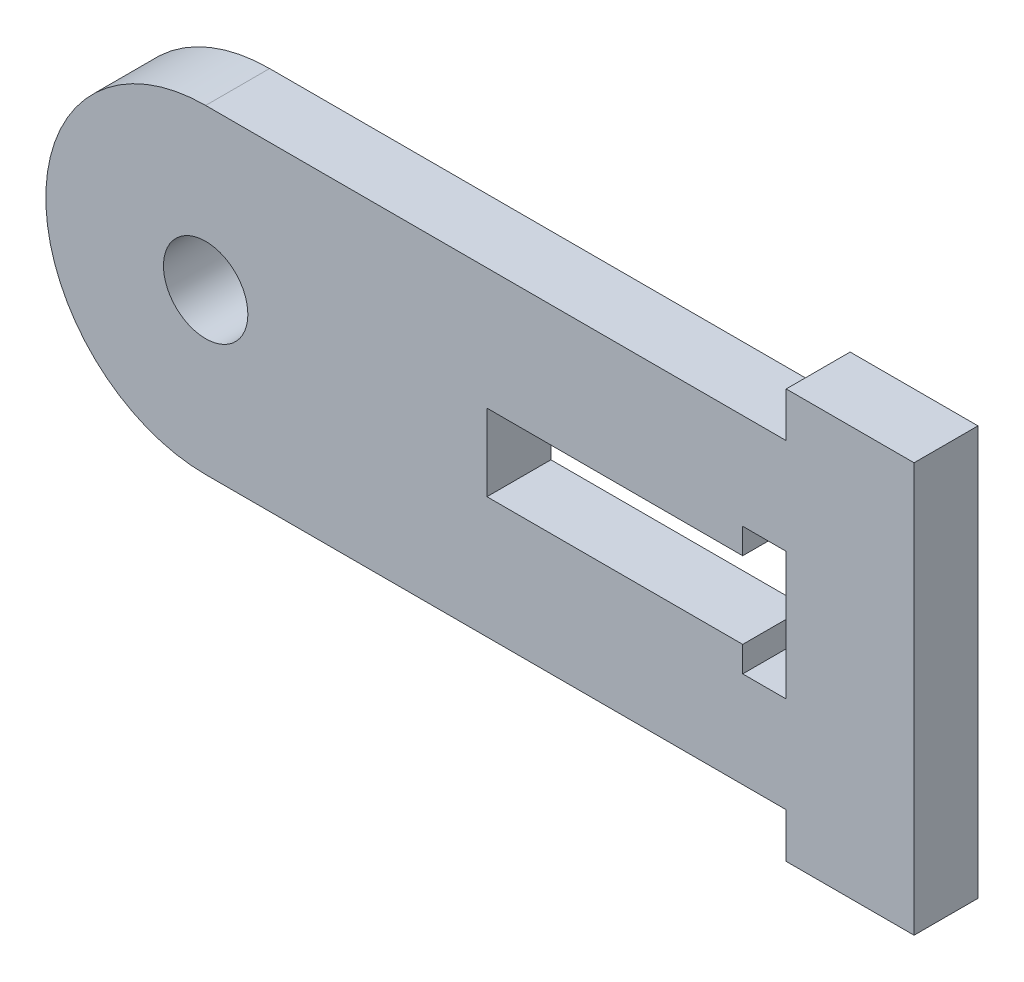
ISO-10303-21;
HEADER;
FILE_DESCRIPTION(('STEP AP214'),'2;1');
FILE_NAME('part.step','',(''),(''),'','','');
FILE_SCHEMA(('AUTOMOTIVE_DESIGN { 1 0 10303 214 1 1 1 1 }'));
ENDSEC;
DATA;
#1=APPLICATION_CONTEXT('core data for automotive mechanical design processes');
#2=APPLICATION_PROTOCOL_DEFINITION('international standard','automotive_design',2000,#1);
#3=PRODUCT_CONTEXT('',#1,'mechanical');
#4=PRODUCT('Part','Part','',(#3));
#5=PRODUCT_RELATED_PRODUCT_CATEGORY('part','',(#4));
#6=PRODUCT_DEFINITION_FORMATION('','',#4);
#7=PRODUCT_DEFINITION_CONTEXT('part definition',#1,'design');
#8=PRODUCT_DEFINITION('design','',#6,#7);
#9=PRODUCT_DEFINITION_SHAPE('','',#8);
#10=(LENGTH_UNIT() NAMED_UNIT(*) SI_UNIT(.MILLI.,.METRE.));
#11=(NAMED_UNIT(*) PLANE_ANGLE_UNIT() SI_UNIT($,.RADIAN.));
#12=(NAMED_UNIT(*) SI_UNIT($,.STERADIAN.) SOLID_ANGLE_UNIT());
#13=UNCERTAINTY_MEASURE_WITH_UNIT(LENGTH_MEASURE(1.E-05),#10,'distance_accuracy_value','');
#14=(GEOMETRIC_REPRESENTATION_CONTEXT(3) GLOBAL_UNCERTAINTY_ASSIGNED_CONTEXT((#13)) GLOBAL_UNIT_ASSIGNED_CONTEXT((#10,
#11,#12)) REPRESENTATION_CONTEXT('',''));
#15=CARTESIAN_POINT('',(0.,0.,0.));
#16=DIRECTION('',(0.,0.,1.));
#17=DIRECTION('',(1.,0.,0.));
#18=AXIS2_PLACEMENT_3D('',#15,#16,#17);
#19=CARTESIAN_POINT('',(21.,2.5,-5.00000000001367E-05));
#20=DIRECTION('',(-1.,0.,0.));
#21=DIRECTION('',(0.,0.,1.));
#22=AXIS2_PLACEMENT_3D('',#19,#20,#21);
#23=PLANE('',#22);
#24=DIRECTION('',(0.,-1.,0.));
#25=VECTOR('',#24,1.);
#26=CARTESIAN_POINT('',(21.,0.,0.));
#27=LINE('',#26,#25);
#28=CARTESIAN_POINT('',(21.,-1.5,0.));
#29=VERTEX_POINT('',#28);
#30=CARTESIAN_POINT('',(21.,-2.5,0.));
#31=VERTEX_POINT('',#30);
#32=EDGE_CURVE('E330',#29,#31,#27,.T.);
#33=ORIENTED_EDGE('',*,*,#32,.F.);
#34=DIRECTION('',(0.,0.,1.));
#35=VECTOR('',#34,1.);
#36=CARTESIAN_POINT('',(21.,-1.5,-5.00000000001367E-05));
#37=LINE('',#36,#35);
#38=CARTESIAN_POINT('',(21.,-1.5,2.5));
#39=VERTEX_POINT('',#38);
#40=EDGE_CURVE('E43',#29,#39,#37,.T.);
#41=ORIENTED_EDGE('',*,*,#40,.T.);
#42=DIRECTION('',(0.,-1.,0.));
#43=VECTOR('',#42,1.);
#44=CARTESIAN_POINT('',(21.,2.5,2.5));
#45=LINE('',#44,#43);
#46=CARTESIAN_POINT('',(21.,-2.5,2.5));
#47=VERTEX_POINT('',#46);
#48=EDGE_CURVE('E173',#39,#47,#45,.T.);
#49=ORIENTED_EDGE('',*,*,#48,.T.);
#50=DIRECTION('',(0.,0.,1.));
#51=VECTOR('',#50,1.);
#52=CARTESIAN_POINT('',(21.,-2.5,-5.00000000001367E-05));
#53=LINE('',#52,#51);
#54=EDGE_CURVE('E185',#31,#47,#53,.T.);
#55=ORIENTED_EDGE('',*,*,#54,.F.);
#56=EDGE_LOOP('',(#33,#41,#49,#55));
#57=FACE_BOUND('',#56,.T.);
#58=ADVANCED_FACE('F35',(#57),#23,.F.);
#59=CARTESIAN_POINT('',(0.,6.25,2.5));
#60=DIRECTION('',(0.,1.,0.));
#61=DIRECTION('',(0.,0.,1.));
#62=AXIS2_PLACEMENT_3D('',#59,#60,#61);
#63=PLANE('',#62);
#64=DIRECTION('',(1.,0.,0.));
#65=VECTOR('',#64,1.);
#66=CARTESIAN_POINT('',(0.,6.25,0.));
#67=LINE('',#66,#65);
#68=CARTESIAN_POINT('',(0.,6.25,0.));
#69=VERTEX_POINT('',#68);
#70=CARTESIAN_POINT('',(22.7,6.25,0.));
#71=VERTEX_POINT('',#70);
#72=EDGE_CURVE('E251',#69,#71,#67,.T.);
#73=ORIENTED_EDGE('',*,*,#72,.F.);
#74=DIRECTION('',(0.,0.,-1.));
#75=VECTOR('',#74,1.);
#76=CARTESIAN_POINT('',(0.,6.25,2.5));
#77=LINE('',#76,#75);
#78=CARTESIAN_POINT('',(0.,6.25,2.5));
#79=VERTEX_POINT('',#78);
#80=EDGE_CURVE('E340',#79,#69,#77,.T.);
#81=ORIENTED_EDGE('',*,*,#80,.F.);
#82=DIRECTION('',(1.,0.,0.));
#83=VECTOR('',#82,1.);
#84=CARTESIAN_POINT('',(0.,6.25,2.5));
#85=LINE('',#84,#83);
#86=CARTESIAN_POINT('',(22.7,6.25,2.5));
#87=VERTEX_POINT('',#86);
#88=EDGE_CURVE('E347',#79,#87,#85,.T.);
#89=ORIENTED_EDGE('',*,*,#88,.T.);
#90=DIRECTION('',(0.,0.,-1.));
#91=VECTOR('',#90,1.);
#92=CARTESIAN_POINT('',(22.7,6.25,2.5));
#93=LINE('',#92,#91);
#94=EDGE_CURVE('E256',#87,#71,#93,.T.);
#95=ORIENTED_EDGE('',*,*,#94,.T.);
#96=EDGE_LOOP('',(#73,#81,#89,#95));
#97=FACE_BOUND('',#96,.T.);
#98=ADVANCED_FACE('F274',(#97),#63,.T.);
#99=CARTESIAN_POINT('',(0.,0.,2.5));
#100=DIRECTION('',(0.,0.,-1.));
#101=DIRECTION('',(-1.,0.,0.));
#102=AXIS2_PLACEMENT_3D('',#99,#100,#101);
#103=CYLINDRICAL_SURFACE('',#102,6.25);
#104=CARTESIAN_POINT('',(0.,0.,0.));
#105=DIRECTION('',(0.,0.,1.));
#106=DIRECTION('',(1.,0.,0.));
#107=AXIS2_PLACEMENT_3D('',#104,#105,#106);
#108=CIRCLE('',#107,6.25);
#109=CARTESIAN_POINT('',(0.,-6.25,0.));
#110=VERTEX_POINT('',#109);
#111=EDGE_CURVE('E344',#69,#110,#108,.T.);
#112=ORIENTED_EDGE('',*,*,#111,.T.);
#113=DIRECTION('',(0.,0.,-1.));
#114=VECTOR('',#113,1.);
#115=CARTESIAN_POINT('',(0.,-6.25,2.5));
#116=LINE('',#115,#114);
#117=CARTESIAN_POINT('',(0.,-6.25,2.5));
#118=VERTEX_POINT('',#117);
#119=EDGE_CURVE('E363',#118,#110,#116,.T.);
#120=ORIENTED_EDGE('',*,*,#119,.F.);
#121=CARTESIAN_POINT('',(0.,0.,2.5));
#122=DIRECTION('',(0.,0.,1.));
#123=DIRECTION('',(1.,0.,0.));
#124=AXIS2_PLACEMENT_3D('',#121,#122,#123);
#125=CIRCLE('',#124,6.25);
#126=EDGE_CURVE('E349',#79,#118,#125,.T.);
#127=ORIENTED_EDGE('',*,*,#126,.F.);
#128=ORIENTED_EDGE('',*,*,#80,.T.);
#129=EDGE_LOOP('',(#112,#120,#127,#128));
#130=FACE_BOUND('',#129,.T.);
#131=ADVANCED_FACE('F280',(#130),#103,.T.);
#132=CARTESIAN_POINT('',(0.,-6.25,2.5));
#133=DIRECTION('',(0.,1.,0.));
#134=DIRECTION('',(0.,0.,1.));
#135=AXIS2_PLACEMENT_3D('',#132,#133,#134);
#136=PLANE('',#135);
#137=DIRECTION('',(1.,0.,0.));
#138=VECTOR('',#137,1.);
#139=CARTESIAN_POINT('',(0.,-6.25,0.));
#140=LINE('',#139,#138);
#141=CARTESIAN_POINT('',(22.7,-6.25,0.));
#142=VERTEX_POINT('',#141);
#143=EDGE_CURVE('E391',#110,#142,#140,.T.);
#144=ORIENTED_EDGE('',*,*,#143,.T.);
#145=DIRECTION('',(0.,0.,-1.));
#146=VECTOR('',#145,1.);
#147=CARTESIAN_POINT('',(22.7,-6.25,2.5));
#148=LINE('',#147,#146);
#149=CARTESIAN_POINT('',(22.7,-6.25,2.5));
#150=VERTEX_POINT('',#149);
#151=EDGE_CURVE('E353',#150,#142,#148,.T.);
#152=ORIENTED_EDGE('',*,*,#151,.F.);
#153=DIRECTION('',(1.,0.,0.));
#154=VECTOR('',#153,1.);
#155=CARTESIAN_POINT('',(0.,-6.25,2.5));
#156=LINE('',#155,#154);
#157=EDGE_CURVE('E354',#118,#150,#156,.T.);
#158=ORIENTED_EDGE('',*,*,#157,.F.);
#159=ORIENTED_EDGE('',*,*,#119,.T.);
#160=EDGE_LOOP('',(#144,#152,#158,#159));
#161=FACE_BOUND('',#160,.T.);
#162=ADVANCED_FACE('F380',(#161),#136,.F.);
#163=CARTESIAN_POINT('',(0.,0.,2.5));
#164=DIRECTION('',(0.,0.,-1.));
#165=DIRECTION('',(-1.,0.,0.));
#166=AXIS2_PLACEMENT_3D('',#163,#164,#165);
#167=CYLINDRICAL_SURFACE('',#166,1.65);
#168=CARTESIAN_POINT('',(0.,0.,2.5));
#169=DIRECTION('',(0.,0.,1.));
#170=DIRECTION('',(1.,0.,0.));
#171=AXIS2_PLACEMENT_3D('',#168,#169,#170);
#172=CIRCLE('',#171,1.65);
#173=CARTESIAN_POINT('',(1.65,0.,2.5));
#174=VERTEX_POINT('',#173);
#175=EDGE_CURVE('E350',#174,#174,#172,.T.);
#176=ORIENTED_EDGE('',*,*,#175,.T.);
#177=EDGE_LOOP('',(#176));
#178=FACE_BOUND('',#177,.T.);
#179=CARTESIAN_POINT('',(0.,0.,0.));
#180=DIRECTION('',(0.,0.,1.));
#181=DIRECTION('',(1.,0.,0.));
#182=AXIS2_PLACEMENT_3D('',#179,#180,#181);
#183=CIRCLE('',#182,1.65);
#184=CARTESIAN_POINT('',(1.65,0.,0.));
#185=VERTEX_POINT('',#184);
#186=EDGE_CURVE('E222',#185,#185,#183,.T.);
#187=ORIENTED_EDGE('',*,*,#186,.F.);
#188=EDGE_LOOP('',(#187));
#189=FACE_BOUND('',#188,.T.);
#190=ADVANCED_FACE('F37',(#178,#189),#167,.F.);
#191=CARTESIAN_POINT('',(0.,0.,2.5));
#192=DIRECTION('',(0.,0.,1.));
#193=DIRECTION('',(1.,0.,0.));
#194=AXIS2_PLACEMENT_3D('',#191,#192,#193);
#195=PLANE('',#194);
#196=DIRECTION('',(1.,0.,0.));
#197=VECTOR('',#196,1.);
#198=CARTESIAN_POINT('',(21.,-1.5,2.5));
#199=LINE('',#198,#197);
#200=CARTESIAN_POINT('',(11.,-1.5,2.5));
#201=VERTEX_POINT('',#200);
#202=EDGE_CURVE('E312',#201,#39,#199,.T.);
#203=ORIENTED_EDGE('',*,*,#202,.F.);
#204=DIRECTION('',(0.,-1.,0.));
#205=VECTOR('',#204,1.);
#206=CARTESIAN_POINT('',(11.,-1.5,2.5));
#207=LINE('',#206,#205);
#208=CARTESIAN_POINT('',(11.,1.5,2.5));
#209=VERTEX_POINT('',#208);
#210=EDGE_CURVE('E167',#209,#201,#207,.T.);
#211=ORIENTED_EDGE('',*,*,#210,.F.);
#212=DIRECTION('',(-1.,0.,0.));
#213=VECTOR('',#212,1.);
#214=CARTESIAN_POINT('',(21.,1.5,2.5));
#215=LINE('',#214,#213);
#216=CARTESIAN_POINT('',(21.,1.5,2.5));
#217=VERTEX_POINT('',#216);
#218=EDGE_CURVE('E151',#217,#209,#215,.T.);
#219=ORIENTED_EDGE('',*,*,#218,.F.);
#220=CARTESIAN_POINT('',(21.,2.5,2.5));
#221=VERTEX_POINT('',#220);
#222=EDGE_CURVE('E165',#221,#217,#45,.T.);
#223=ORIENTED_EDGE('',*,*,#222,.F.);
#224=DIRECTION('',(-1.,0.,0.));
#225=VECTOR('',#224,1.);
#226=CARTESIAN_POINT('',(22.7,2.5,2.5));
#227=LINE('',#226,#225);
#228=CARTESIAN_POINT('',(22.7,2.5,2.5));
#229=VERTEX_POINT('',#228);
#230=EDGE_CURVE('E178',#229,#221,#227,.T.);
#231=ORIENTED_EDGE('',*,*,#230,.F.);
#232=DIRECTION('',(0.,1.,0.));
#233=VECTOR('',#232,1.);
#234=CARTESIAN_POINT('',(22.7,2.5,2.5));
#235=LINE('',#234,#233);
#236=CARTESIAN_POINT('',(22.7,-2.5,2.5));
#237=VERTEX_POINT('',#236);
#238=EDGE_CURVE('E58',#237,#229,#235,.T.);
#239=ORIENTED_EDGE('',*,*,#238,.F.);
#240=DIRECTION('',(1.,0.,0.));
#241=VECTOR('',#240,1.);
#242=CARTESIAN_POINT('',(22.7,-2.5,2.5));
#243=LINE('',#242,#241);
#244=EDGE_CURVE('E172',#47,#237,#243,.T.);
#245=ORIENTED_EDGE('',*,*,#244,.F.);
#246=ORIENTED_EDGE('',*,*,#48,.F.);
#247=EDGE_LOOP('',(#203,#211,#219,#223,#231,#239,#245,#246));
#248=FACE_BOUND('',#247,.T.);
#249=ORIENTED_EDGE('',*,*,#175,.F.);
#250=EDGE_LOOP('',(#249));
#251=FACE_BOUND('',#250,.T.);
#252=ORIENTED_EDGE('',*,*,#88,.F.);
#253=ORIENTED_EDGE('',*,*,#126,.T.);
#254=ORIENTED_EDGE('',*,*,#157,.T.);
#255=DIRECTION('',(0.,-1.,0.));
#256=VECTOR('',#255,1.);
#257=CARTESIAN_POINT('',(22.7,-8.,2.5));
#258=LINE('',#257,#256);
#259=CARTESIAN_POINT('',(22.7,-8.,2.5));
#260=VERTEX_POINT('',#259);
#261=EDGE_CURVE('E184',#150,#260,#258,.T.);
#262=ORIENTED_EDGE('',*,*,#261,.T.);
#263=DIRECTION('',(1.,0.,0.));
#264=VECTOR('',#263,1.);
#265=CARTESIAN_POINT('',(22.7,-8.,2.5));
#266=LINE('',#265,#264);
#267=CARTESIAN_POINT('',(27.7,-8.,2.5));
#268=VERTEX_POINT('',#267);
#269=EDGE_CURVE('E210',#260,#268,#266,.T.);
#270=ORIENTED_EDGE('',*,*,#269,.T.);
#271=DIRECTION('',(0.,1.,0.));
#272=VECTOR('',#271,1.);
#273=CARTESIAN_POINT('',(27.7,-8.,2.5));
#274=LINE('',#273,#272);
#275=CARTESIAN_POINT('',(27.7,8.,2.5));
#276=VERTEX_POINT('',#275);
#277=EDGE_CURVE('E214',#268,#276,#274,.T.);
#278=ORIENTED_EDGE('',*,*,#277,.T.);
#279=DIRECTION('',(-1.,0.,0.));
#280=VECTOR('',#279,1.);
#281=CARTESIAN_POINT('',(22.7,8.,2.5));
#282=LINE('',#281,#280);
#283=CARTESIAN_POINT('',(22.7,8.,2.5));
#284=VERTEX_POINT('',#283);
#285=EDGE_CURVE('E217',#276,#284,#282,.T.);
#286=ORIENTED_EDGE('',*,*,#285,.T.);
#287=EDGE_CURVE('E204',#284,#87,#258,.T.);
#288=ORIENTED_EDGE('',*,*,#287,.T.);
#289=EDGE_LOOP('',(#252,#253,#254,#262,#270,#278,#286,#288));
#290=FACE_BOUND('',#289,.T.);
#291=ADVANCED_FACE('F162',(#248,#251,#290),#195,.T.);
#292=CARTESIAN_POINT('',(0.,0.,0.));
#293=DIRECTION('',(0.,0.,1.));
#294=DIRECTION('',(1.,0.,0.));
#295=AXIS2_PLACEMENT_3D('',#292,#293,#294);
#296=PLANE('',#295);
#297=DIRECTION('',(0.,-1.,0.));
#298=VECTOR('',#297,1.);
#299=CARTESIAN_POINT('',(11.,0.,0.));
#300=LINE('',#299,#298);
#301=CARTESIAN_POINT('',(11.,1.5,0.));
#302=VERTEX_POINT('',#301);
#303=CARTESIAN_POINT('',(11.,-1.5,0.));
#304=VERTEX_POINT('',#303);
#305=EDGE_CURVE('E11',#302,#304,#300,.T.);
#306=ORIENTED_EDGE('',*,*,#305,.T.);
#307=DIRECTION('',(1.,0.,0.));
#308=VECTOR('',#307,1.);
#309=CARTESIAN_POINT('',(0.,-1.5,0.));
#310=LINE('',#309,#308);
#311=EDGE_CURVE('E315',#304,#29,#310,.T.);
#312=ORIENTED_EDGE('',*,*,#311,.T.);
#313=ORIENTED_EDGE('',*,*,#32,.T.);
#314=DIRECTION('',(1.,0.,0.));
#315=VECTOR('',#314,1.);
#316=CARTESIAN_POINT('',(0.,-2.5,0.));
#317=LINE('',#316,#315);
#318=CARTESIAN_POINT('',(22.7,-2.5,0.));
#319=VERTEX_POINT('',#318);
#320=EDGE_CURVE('E329',#31,#319,#317,.T.);
#321=ORIENTED_EDGE('',*,*,#320,.T.);
#322=DIRECTION('',(0.,1.,0.));
#323=VECTOR('',#322,1.);
#324=CARTESIAN_POINT('',(22.7,0.,0.));
#325=LINE('',#324,#323);
#326=CARTESIAN_POINT('',(22.7,2.5,0.));
#327=VERTEX_POINT('',#326);
#328=EDGE_CURVE('E157',#319,#327,#325,.T.);
#329=ORIENTED_EDGE('',*,*,#328,.T.);
#330=DIRECTION('',(-1.,0.,0.));
#331=VECTOR('',#330,1.);
#332=CARTESIAN_POINT('',(0.,2.5,0.));
#333=LINE('',#332,#331);
#334=CARTESIAN_POINT('',(21.,2.5,0.));
#335=VERTEX_POINT('',#334);
#336=EDGE_CURVE('E337',#327,#335,#333,.T.);
#337=ORIENTED_EDGE('',*,*,#336,.T.);
#338=CARTESIAN_POINT('',(21.,1.5,0.));
#339=VERTEX_POINT('',#338);
#340=EDGE_CURVE('E335',#335,#339,#27,.T.);
#341=ORIENTED_EDGE('',*,*,#340,.T.);
#342=DIRECTION('',(-1.,0.,0.));
#343=VECTOR('',#342,1.);
#344=CARTESIAN_POINT('',(0.,1.5,0.));
#345=LINE('',#344,#343);
#346=EDGE_CURVE('E50',#339,#302,#345,.T.);
#347=ORIENTED_EDGE('',*,*,#346,.T.);
#348=EDGE_LOOP('',(#306,#312,#313,#321,#329,#337,#341,#347));
#349=FACE_BOUND('',#348,.T.);
#350=ORIENTED_EDGE('',*,*,#186,.T.);
#351=EDGE_LOOP('',(#350));
#352=FACE_BOUND('',#351,.T.);
#353=ORIENTED_EDGE('',*,*,#72,.T.);
#354=DIRECTION('',(0.,-1.,0.));
#355=VECTOR('',#354,1.);
#356=CARTESIAN_POINT('',(22.7,-8.,0.));
#357=LINE('',#356,#355);
#358=CARTESIAN_POINT('',(22.7,8.,0.));
#359=VERTEX_POINT('',#358);
#360=EDGE_CURVE('E199',#359,#71,#357,.T.);
#361=ORIENTED_EDGE('',*,*,#360,.F.);
#362=DIRECTION('',(-1.,0.,0.));
#363=VECTOR('',#362,1.);
#364=CARTESIAN_POINT('',(22.7,8.,0.));
#365=LINE('',#364,#363);
#366=CARTESIAN_POINT('',(27.7,8.,0.));
#367=VERTEX_POINT('',#366);
#368=EDGE_CURVE('E209',#367,#359,#365,.T.);
#369=ORIENTED_EDGE('',*,*,#368,.F.);
#370=DIRECTION('',(0.,1.,0.));
#371=VECTOR('',#370,1.);
#372=CARTESIAN_POINT('',(27.7,-8.,0.));
#373=LINE('',#372,#371);
#374=CARTESIAN_POINT('',(27.7,-8.,0.));
#375=VERTEX_POINT('',#374);
#376=EDGE_CURVE('E233',#375,#367,#373,.T.);
#377=ORIENTED_EDGE('',*,*,#376,.F.);
#378=DIRECTION('',(1.,0.,0.));
#379=VECTOR('',#378,1.);
#380=CARTESIAN_POINT('',(22.7,-8.,0.));
#381=LINE('',#380,#379);
#382=CARTESIAN_POINT('',(22.7,-8.,0.));
#383=VERTEX_POINT('',#382);
#384=EDGE_CURVE('E192',#383,#375,#381,.T.);
#385=ORIENTED_EDGE('',*,*,#384,.F.);
#386=EDGE_CURVE('E196',#142,#383,#357,.T.);
#387=ORIENTED_EDGE('',*,*,#386,.F.);
#388=ORIENTED_EDGE('',*,*,#143,.F.);
#389=ORIENTED_EDGE('',*,*,#111,.F.);
#390=EDGE_LOOP('',(#353,#361,#369,#377,#385,#387,#388,#389));
#391=FACE_BOUND('',#390,.T.);
#392=ADVANCED_FACE('F247',(#349,#352,#391),#296,.F.);
#393=CARTESIAN_POINT('',(22.7,-8.,0.));
#394=DIRECTION('',(-1.,0.,0.));
#395=DIRECTION('',(0.,0.,1.));
#396=AXIS2_PLACEMENT_3D('',#393,#394,#395);
#397=PLANE('',#396);
#398=ORIENTED_EDGE('',*,*,#94,.F.);
#399=ORIENTED_EDGE('',*,*,#287,.F.);
#400=DIRECTION('',(0.,0.,1.));
#401=VECTOR('',#400,1.);
#402=CARTESIAN_POINT('',(22.7,8.,0.));
#403=LINE('',#402,#401);
#404=EDGE_CURVE('E220',#359,#284,#403,.T.);
#405=ORIENTED_EDGE('',*,*,#404,.F.);
#406=ORIENTED_EDGE('',*,*,#360,.T.);
#407=EDGE_LOOP('',(#398,#399,#405,#406));
#408=FACE_BOUND('',#407,.T.);
#409=ADVANCED_FACE('F254',(#408),#397,.T.);
#410=ORIENTED_EDGE('',*,*,#261,.F.);
#411=ORIENTED_EDGE('',*,*,#151,.T.);
#412=ORIENTED_EDGE('',*,*,#386,.T.);
#413=DIRECTION('',(0.,0.,1.));
#414=VECTOR('',#413,1.);
#415=CARTESIAN_POINT('',(22.7,-8.,0.));
#416=LINE('',#415,#414);
#417=EDGE_CURVE('E226',#383,#260,#416,.T.);
#418=ORIENTED_EDGE('',*,*,#417,.T.);
#419=EDGE_LOOP('',(#410,#411,#412,#418));
#420=FACE_BOUND('',#419,.T.);
#421=ADVANCED_FACE('F271',(#420),#397,.T.);
#422=CARTESIAN_POINT('',(22.7,8.,0.));
#423=DIRECTION('',(0.,1.,0.));
#424=DIRECTION('',(0.,0.,1.));
#425=AXIS2_PLACEMENT_3D('',#422,#423,#424);
#426=PLANE('',#425);
#427=ORIENTED_EDGE('',*,*,#285,.F.);
#428=DIRECTION('',(0.,0.,1.));
#429=VECTOR('',#428,1.);
#430=CARTESIAN_POINT('',(27.7,8.,0.));
#431=LINE('',#430,#429);
#432=EDGE_CURVE('E223',#367,#276,#431,.T.);
#433=ORIENTED_EDGE('',*,*,#432,.F.);
#434=ORIENTED_EDGE('',*,*,#368,.T.);
#435=ORIENTED_EDGE('',*,*,#404,.T.);
#436=EDGE_LOOP('',(#427,#433,#434,#435));
#437=FACE_BOUND('',#436,.T.);
#438=ADVANCED_FACE('F259',(#437),#426,.T.);
#439=CARTESIAN_POINT('',(27.7,-8.,0.));
#440=DIRECTION('',(1.,0.,0.));
#441=DIRECTION('',(0.,0.,-1.));
#442=AXIS2_PLACEMENT_3D('',#439,#440,#441);
#443=PLANE('',#442);
#444=ORIENTED_EDGE('',*,*,#277,.F.);
#445=DIRECTION('',(0.,0.,1.));
#446=VECTOR('',#445,1.);
#447=CARTESIAN_POINT('',(27.7,-8.,0.));
#448=LINE('',#447,#446);
#449=EDGE_CURVE('E225',#375,#268,#448,.T.);
#450=ORIENTED_EDGE('',*,*,#449,.F.);
#451=ORIENTED_EDGE('',*,*,#376,.T.);
#452=ORIENTED_EDGE('',*,*,#432,.T.);
#453=EDGE_LOOP('',(#444,#450,#451,#452));
#454=FACE_BOUND('',#453,.T.);
#455=ADVANCED_FACE('F262',(#454),#443,.T.);
#456=CARTESIAN_POINT('',(22.7,-8.,0.));
#457=DIRECTION('',(0.,-1.,0.));
#458=DIRECTION('',(0.,0.,-1.));
#459=AXIS2_PLACEMENT_3D('',#456,#457,#458);
#460=PLANE('',#459);
#461=ORIENTED_EDGE('',*,*,#269,.F.);
#462=ORIENTED_EDGE('',*,*,#417,.F.);
#463=ORIENTED_EDGE('',*,*,#384,.T.);
#464=ORIENTED_EDGE('',*,*,#449,.T.);
#465=EDGE_LOOP('',(#461,#462,#463,#464));
#466=FACE_BOUND('',#465,.T.);
#467=ADVANCED_FACE('F242',(#466),#460,.T.);
#468=CARTESIAN_POINT('',(22.7,2.5,-5.00000000001367E-05));
#469=DIRECTION('',(1.,0.,0.));
#470=DIRECTION('',(0.,0.,-1.));
#471=AXIS2_PLACEMENT_3D('',#468,#469,#470);
#472=PLANE('',#471);
#473=DIRECTION('',(0.,0.,1.));
#474=VECTOR('',#473,1.);
#475=CARTESIAN_POINT('',(22.7,-2.5,-5.00000000001367E-05));
#476=LINE('',#475,#474);
#477=EDGE_CURVE('E182',#319,#237,#476,.T.);
#478=ORIENTED_EDGE('',*,*,#477,.T.);
#479=ORIENTED_EDGE('',*,*,#238,.T.);
#480=DIRECTION('',(0.,0.,1.));
#481=VECTOR('',#480,1.);
#482=CARTESIAN_POINT('',(22.7,2.5,-5.00000000001367E-05));
#483=LINE('',#482,#481);
#484=EDGE_CURVE('E176',#327,#229,#483,.T.);
#485=ORIENTED_EDGE('',*,*,#484,.F.);
#486=ORIENTED_EDGE('',*,*,#328,.F.);
#487=EDGE_LOOP('',(#478,#479,#485,#486));
#488=FACE_BOUND('',#487,.T.);
#489=ADVANCED_FACE('F269',(#488),#472,.F.);
#490=CARTESIAN_POINT('',(22.7,-2.5,-5.00000000001367E-05));
#491=DIRECTION('',(0.,-1.,0.));
#492=DIRECTION('',(0.,0.,-1.));
#493=AXIS2_PLACEMENT_3D('',#490,#491,#492);
#494=PLANE('',#493);
#495=ORIENTED_EDGE('',*,*,#54,.T.);
#496=ORIENTED_EDGE('',*,*,#244,.T.);
#497=ORIENTED_EDGE('',*,*,#477,.F.);
#498=ORIENTED_EDGE('',*,*,#320,.F.);
#499=EDGE_LOOP('',(#495,#496,#497,#498));
#500=FACE_BOUND('',#499,.T.);
#501=ADVANCED_FACE('F287',(#500),#494,.F.);
#502=ORIENTED_EDGE('',*,*,#222,.T.);
#503=DIRECTION('',(0.,0.,-1.));
#504=VECTOR('',#503,1.);
#505=CARTESIAN_POINT('',(21.,1.5,-5.00000000001367E-05));
#506=LINE('',#505,#504);
#507=EDGE_CURVE('E148',#217,#339,#506,.T.);
#508=ORIENTED_EDGE('',*,*,#507,.T.);
#509=ORIENTED_EDGE('',*,*,#340,.F.);
#510=DIRECTION('',(0.,0.,1.));
#511=VECTOR('',#510,1.);
#512=CARTESIAN_POINT('',(21.,2.5,-5.00000000001367E-05));
#513=LINE('',#512,#511);
#514=EDGE_CURVE('E170',#335,#221,#513,.T.);
#515=ORIENTED_EDGE('',*,*,#514,.T.);
#516=EDGE_LOOP('',(#502,#508,#509,#515));
#517=FACE_BOUND('',#516,.T.);
#518=ADVANCED_FACE('F169',(#517),#23,.F.);
#519=CARTESIAN_POINT('',(22.7,2.5,-5.00000000001367E-05));
#520=DIRECTION('',(0.,1.,0.));
#521=DIRECTION('',(0.,0.,1.));
#522=AXIS2_PLACEMENT_3D('',#519,#520,#521);
#523=PLANE('',#522);
#524=ORIENTED_EDGE('',*,*,#484,.T.);
#525=ORIENTED_EDGE('',*,*,#230,.T.);
#526=ORIENTED_EDGE('',*,*,#514,.F.);
#527=ORIENTED_EDGE('',*,*,#336,.F.);
#528=EDGE_LOOP('',(#524,#525,#526,#527));
#529=FACE_BOUND('',#528,.T.);
#530=ADVANCED_FACE('F286',(#529),#523,.F.);
#531=CARTESIAN_POINT('',(11.,-1.5,-5.00000000001367E-05));
#532=DIRECTION('',(-1.,0.,0.));
#533=DIRECTION('',(0.,0.,1.));
#534=AXIS2_PLACEMENT_3D('',#531,#532,#533);
#535=PLANE('',#534);
#536=DIRECTION('',(0.,0.,1.));
#537=VECTOR('',#536,1.);
#538=CARTESIAN_POINT('',(11.,1.5,-5.00000000001367E-05));
#539=LINE('',#538,#537);
#540=EDGE_CURVE('E316',#302,#209,#539,.T.);
#541=ORIENTED_EDGE('',*,*,#540,.T.);
#542=ORIENTED_EDGE('',*,*,#210,.T.);
#543=DIRECTION('',(0.,0.,1.));
#544=VECTOR('',#543,1.);
#545=CARTESIAN_POINT('',(11.,-1.5,-5.00000000001367E-05));
#546=LINE('',#545,#544);
#547=EDGE_CURVE('E311',#304,#201,#546,.T.);
#548=ORIENTED_EDGE('',*,*,#547,.F.);
#549=ORIENTED_EDGE('',*,*,#305,.F.);
#550=EDGE_LOOP('',(#541,#542,#548,#549));
#551=FACE_BOUND('',#550,.T.);
#552=ADVANCED_FACE('F292',(#551),#535,.F.);
#553=CARTESIAN_POINT('',(21.,-1.5,-5.00000000001367E-05));
#554=DIRECTION('',(0.,-1.,0.));
#555=DIRECTION('',(1.,0.,0.));
#556=AXIS2_PLACEMENT_3D('',#553,#554,#555);
#557=PLANE('',#556);
#558=ORIENTED_EDGE('',*,*,#547,.T.);
#559=ORIENTED_EDGE('',*,*,#202,.T.);
#560=ORIENTED_EDGE('',*,*,#40,.F.);
#561=ORIENTED_EDGE('',*,*,#311,.F.);
#562=EDGE_LOOP('',(#558,#559,#560,#561));
#563=FACE_BOUND('',#562,.T.);
#564=ADVANCED_FACE('F302',(#563),#557,.F.);
#565=CARTESIAN_POINT('',(21.,1.5,-5.00000000001367E-05));
#566=DIRECTION('',(0.,1.,0.));
#567=DIRECTION('',(-1.,0.,0.));
#568=AXIS2_PLACEMENT_3D('',#565,#566,#567);
#569=PLANE('',#568);
#570=ORIENTED_EDGE('',*,*,#507,.F.);
#571=ORIENTED_EDGE('',*,*,#218,.T.);
#572=ORIENTED_EDGE('',*,*,#540,.F.);
#573=ORIENTED_EDGE('',*,*,#346,.F.);
#574=EDGE_LOOP('',(#570,#571,#572,#573));
#575=FACE_BOUND('',#574,.T.);
#576=ADVANCED_FACE('F150',(#575),#569,.F.);
#577=CLOSED_SHELL('',(#58,#98,#131,#162,#190,#291,#392,#409,#421,#438,#455,#467,#489,#501,#518,
#530,#552,#564,#576));
#578=MANIFOLD_SOLID_BREP('B2',#577);
#579=ADVANCED_BREP_SHAPE_REPRESENTATION('',(#18,#578),#14);
#580=SHAPE_DEFINITION_REPRESENTATION(#9,#579);
ENDSEC;
END-ISO-10303-21;
